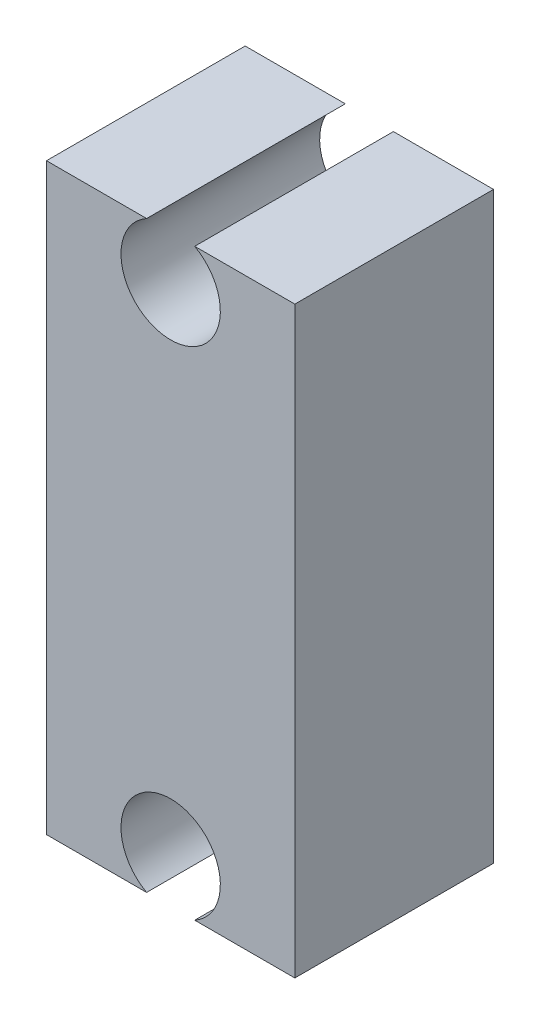
ISO-10303-21;
HEADER;
FILE_DESCRIPTION(('STEP AP214'),'2;1');
FILE_NAME('part.step','',(''),(''),'','','');
FILE_SCHEMA(('AUTOMOTIVE_DESIGN { 1 0 10303 214 1 1 1 1 }'));
ENDSEC;
DATA;
#1=APPLICATION_CONTEXT('core data for automotive mechanical design processes');
#2=APPLICATION_PROTOCOL_DEFINITION('international standard','automotive_design',2000,#1);
#3=PRODUCT_CONTEXT('',#1,'mechanical');
#4=PRODUCT('Part','Part','',(#3));
#5=PRODUCT_RELATED_PRODUCT_CATEGORY('part','',(#4));
#6=PRODUCT_DEFINITION_FORMATION('','',#4);
#7=PRODUCT_DEFINITION_CONTEXT('part definition',#1,'design');
#8=PRODUCT_DEFINITION('design','',#6,#7);
#9=PRODUCT_DEFINITION_SHAPE('','',#8);
#10=(LENGTH_UNIT() NAMED_UNIT(*) SI_UNIT(.MILLI.,.METRE.));
#11=(NAMED_UNIT(*) PLANE_ANGLE_UNIT() SI_UNIT($,.RADIAN.));
#12=(NAMED_UNIT(*) SI_UNIT($,.STERADIAN.) SOLID_ANGLE_UNIT());
#13=UNCERTAINTY_MEASURE_WITH_UNIT(LENGTH_MEASURE(1.E-05),#10,'distance_accuracy_value','');
#14=(GEOMETRIC_REPRESENTATION_CONTEXT(3) GLOBAL_UNCERTAINTY_ASSIGNED_CONTEXT((#13)) GLOBAL_UNIT_ASSIGNED_CONTEXT((#10,
#11,#12)) REPRESENTATION_CONTEXT('',''));
#15=CARTESIAN_POINT('',(0.,0.,0.));
#16=DIRECTION('',(0.,0.,1.));
#17=DIRECTION('',(1.,0.,0.));
#18=AXIS2_PLACEMENT_3D('',#15,#16,#17);
#19=CARTESIAN_POINT('',(-12.7,-15.8514814814815,10.16));
#20=DIRECTION('',(0.,1.,0.));
#21=DIRECTION('',(0.,0.,1.));
#22=AXIS2_PLACEMENT_3D('',#19,#20,#21);
#23=PLANE('',#22);
#24=DIRECTION('',(1.,0.,0.));
#25=VECTOR('',#24,1.);
#26=CARTESIAN_POINT('',(-12.7,-15.8514814814815,0.));
#27=LINE('',#26,#25);
#28=CARTESIAN_POINT('',(-12.7,-15.8514814814815,0.));
#29=VERTEX_POINT('',#28);
#30=CARTESIAN_POINT('',(-7.57967221242086,-15.8514814814815,0.));
#31=VERTEX_POINT('',#30);
#32=EDGE_CURVE('E126',#29,#31,#27,.T.);
#33=ORIENTED_EDGE('',*,*,#32,.T.);
#34=DIRECTION('',(0.,0.,1.));
#35=VECTOR('',#34,1.);
#36=CARTESIAN_POINT('',(-7.57967221242086,-15.8514814814815,0.));
#37=LINE('',#36,#35);
#38=CARTESIAN_POINT('',(-7.57967221242086,-15.8514814814815,10.16));
#39=VERTEX_POINT('',#38);
#40=EDGE_CURVE('E55',#31,#39,#37,.T.);
#41=ORIENTED_EDGE('',*,*,#40,.T.);
#42=DIRECTION('',(1.,0.,0.));
#43=VECTOR('',#42,1.);
#44=CARTESIAN_POINT('',(-12.7,-15.8514814814815,10.16));
#45=LINE('',#44,#43);
#46=CARTESIAN_POINT('',(-12.7,-15.8514814814815,10.16));
#47=VERTEX_POINT('',#46);
#48=EDGE_CURVE('E160',#47,#39,#45,.T.);
#49=ORIENTED_EDGE('',*,*,#48,.F.);
#50=DIRECTION('',(0.,0.,-1.));
#51=VECTOR('',#50,1.);
#52=CARTESIAN_POINT('',(-12.7,-15.8514814814815,10.16));
#53=LINE('',#52,#51);
#54=EDGE_CURVE('E109',#47,#29,#53,.T.);
#55=ORIENTED_EDGE('',*,*,#54,.T.);
#56=EDGE_LOOP('',(#33,#41,#49,#55));
#57=FACE_BOUND('',#56,.T.);
#58=ADVANCED_FACE('F39',(#57),#23,.F.);
#59=CARTESIAN_POINT('',(-12.7,13.9935185185185,10.16));
#60=DIRECTION('',(0.,-1.,0.));
#61=DIRECTION('',(0.,0.,-1.));
#62=AXIS2_PLACEMENT_3D('',#59,#60,#61);
#63=PLANE('',#62);
#64=DIRECTION('',(-1.,0.,0.));
#65=VECTOR('',#64,1.);
#66=CARTESIAN_POINT('',(-12.7,13.9935185185185,0.));
#67=LINE('',#66,#65);
#68=CARTESIAN_POINT('',(0.,13.9935185185185,0.));
#69=VERTEX_POINT('',#68);
#70=CARTESIAN_POINT('',(-5.12032778757915,13.9935185185185,0.));
#71=VERTEX_POINT('',#70);
#72=EDGE_CURVE('E138',#69,#71,#67,.T.);
#73=ORIENTED_EDGE('',*,*,#72,.T.);
#74=DIRECTION('',(0.,0.,1.));
#75=VECTOR('',#74,1.);
#76=CARTESIAN_POINT('',(-5.12032778757915,13.9935185185185,0.));
#77=LINE('',#76,#75);
#78=CARTESIAN_POINT('',(-5.12032778757915,13.9935185185185,10.16));
#79=VERTEX_POINT('',#78);
#80=EDGE_CURVE('E63',#71,#79,#77,.T.);
#81=ORIENTED_EDGE('',*,*,#80,.T.);
#82=DIRECTION('',(-1.,0.,0.));
#83=VECTOR('',#82,1.);
#84=CARTESIAN_POINT('',(-12.7,13.9935185185185,10.16));
#85=LINE('',#84,#83);
#86=CARTESIAN_POINT('',(0.,13.9935185185185,10.16));
#87=VERTEX_POINT('',#86);
#88=EDGE_CURVE('E148',#87,#79,#85,.T.);
#89=ORIENTED_EDGE('',*,*,#88,.F.);
#90=DIRECTION('',(0.,0.,-1.));
#91=VECTOR('',#90,1.);
#92=CARTESIAN_POINT('',(0.,13.9935185185185,10.16));
#93=LINE('',#92,#91);
#94=EDGE_CURVE('E147',#87,#69,#93,.T.);
#95=ORIENTED_EDGE('',*,*,#94,.T.);
#96=EDGE_LOOP('',(#73,#81,#89,#95));
#97=FACE_BOUND('',#96,.T.);
#98=ADVANCED_FACE('F199',(#97),#63,.F.);
#99=CARTESIAN_POINT('',(-12.7,13.9935185185185,10.16));
#100=DIRECTION('',(1.,0.,0.));
#101=DIRECTION('',(0.,1.,0.));
#102=AXIS2_PLACEMENT_3D('',#99,#100,#101);
#103=PLANE('',#102);
#104=DIRECTION('',(0.,-1.,0.));
#105=VECTOR('',#104,1.);
#106=CARTESIAN_POINT('',(-12.7,13.9935185185185,0.));
#107=LINE('',#106,#105);
#108=CARTESIAN_POINT('',(-12.7,13.9935185185185,0.));
#109=VERTEX_POINT('',#108);
#110=EDGE_CURVE('E127',#109,#29,#107,.T.);
#111=ORIENTED_EDGE('',*,*,#110,.T.);
#112=ORIENTED_EDGE('',*,*,#54,.F.);
#113=DIRECTION('',(0.,-1.,0.));
#114=VECTOR('',#113,1.);
#115=CARTESIAN_POINT('',(-12.7,13.9935185185185,10.16));
#116=LINE('',#115,#114);
#117=CARTESIAN_POINT('',(-12.7,13.9935185185185,10.16));
#118=VERTEX_POINT('',#117);
#119=EDGE_CURVE('E142',#118,#47,#116,.T.);
#120=ORIENTED_EDGE('',*,*,#119,.F.);
#121=DIRECTION('',(0.,0.,-1.));
#122=VECTOR('',#121,1.);
#123=CARTESIAN_POINT('',(-12.7,13.9935185185185,10.16));
#124=LINE('',#123,#122);
#125=EDGE_CURVE('E143',#118,#109,#124,.T.);
#126=ORIENTED_EDGE('',*,*,#125,.T.);
#127=EDGE_LOOP('',(#111,#112,#120,#126));
#128=FACE_BOUND('',#127,.T.);
#129=ADVANCED_FACE('F41',(#128),#103,.F.);
#130=CARTESIAN_POINT('',(-5.12032778757914,-15.8514814814815,10.16));
#131=VERTEX_POINT('',#130);
#132=CARTESIAN_POINT('',(0.,-15.8514814814815,10.16));
#133=VERTEX_POINT('',#132);
#134=EDGE_CURVE('E116',#131,#133,#45,.T.);
#135=ORIENTED_EDGE('',*,*,#134,.F.);
#136=DIRECTION('',(0.,0.,1.));
#137=VECTOR('',#136,1.);
#138=CARTESIAN_POINT('',(-5.12032778757914,-15.8514814814815,0.));
#139=LINE('',#138,#137);
#140=CARTESIAN_POINT('',(-5.12032778757914,-15.8514814814815,0.));
#141=VERTEX_POINT('',#140);
#142=EDGE_CURVE('E103',#131,#141,#139,.F.);
#143=ORIENTED_EDGE('',*,*,#142,.T.);
#144=CARTESIAN_POINT('',(0.,-15.8514814814815,0.));
#145=VERTEX_POINT('',#144);
#146=EDGE_CURVE('E114',#141,#145,#27,.T.);
#147=ORIENTED_EDGE('',*,*,#146,.T.);
#148=DIRECTION('',(0.,0.,-1.));
#149=VECTOR('',#148,1.);
#150=CARTESIAN_POINT('',(0.,-15.8514814814815,10.16));
#151=LINE('',#150,#149);
#152=EDGE_CURVE('E152',#133,#145,#151,.T.);
#153=ORIENTED_EDGE('',*,*,#152,.F.);
#154=EDGE_LOOP('',(#135,#143,#147,#153));
#155=FACE_BOUND('',#154,.T.);
#156=ADVANCED_FACE('F112',(#155),#23,.F.);
#157=CARTESIAN_POINT('',(0.,13.9935185185185,10.16));
#158=DIRECTION('',(-1.,0.,0.));
#159=DIRECTION('',(0.,-1.,0.));
#160=AXIS2_PLACEMENT_3D('',#157,#158,#159);
#161=PLANE('',#160);
#162=DIRECTION('',(0.,1.,0.));
#163=VECTOR('',#162,1.);
#164=CARTESIAN_POINT('',(0.,13.9935185185185,0.));
#165=LINE('',#164,#163);
#166=EDGE_CURVE('E124',#145,#69,#165,.T.);
#167=ORIENTED_EDGE('',*,*,#166,.T.);
#168=ORIENTED_EDGE('',*,*,#94,.F.);
#169=DIRECTION('',(0.,1.,0.));
#170=VECTOR('',#169,1.);
#171=CARTESIAN_POINT('',(0.,13.9935185185185,10.16));
#172=LINE('',#171,#170);
#173=EDGE_CURVE('E175',#133,#87,#172,.T.);
#174=ORIENTED_EDGE('',*,*,#173,.F.);
#175=ORIENTED_EDGE('',*,*,#152,.T.);
#176=EDGE_LOOP('',(#167,#168,#174,#175));
#177=FACE_BOUND('',#176,.T.);
#178=ADVANCED_FACE('F203',(#177),#161,.F.);
#179=CARTESIAN_POINT('',(-7.57967221242086,13.9935185185185,10.16));
#180=VERTEX_POINT('',#179);
#181=EDGE_CURVE('E177',#180,#118,#85,.T.);
#182=ORIENTED_EDGE('',*,*,#181,.F.);
#183=DIRECTION('',(0.,0.,1.));
#184=VECTOR('',#183,1.);
#185=CARTESIAN_POINT('',(-7.57967221242086,13.9935185185185,0.));
#186=LINE('',#185,#184);
#187=CARTESIAN_POINT('',(-7.57967221242086,13.9935185185185,0.));
#188=VERTEX_POINT('',#187);
#189=EDGE_CURVE('E187',#180,#188,#186,.F.);
#190=ORIENTED_EDGE('',*,*,#189,.T.);
#191=EDGE_CURVE('E137',#188,#109,#67,.T.);
#192=ORIENTED_EDGE('',*,*,#191,.T.);
#193=ORIENTED_EDGE('',*,*,#125,.F.);
#194=EDGE_LOOP('',(#182,#190,#192,#193));
#195=FACE_BOUND('',#194,.T.);
#196=ADVANCED_FACE('F205',(#195),#63,.F.);
#197=CARTESIAN_POINT('',(0.,0.,10.16));
#198=DIRECTION('',(0.,0.,1.));
#199=DIRECTION('',(1.,0.,0.));
#200=AXIS2_PLACEMENT_3D('',#197,#198,#199);
#201=PLANE('',#200);
#202=CARTESIAN_POINT('',(-6.35,11.7710185185185,10.16));
#203=DIRECTION('',(0.,0.,1.));
#204=DIRECTION('',(1.,0.,0.));
#205=AXIS2_PLACEMENT_3D('',#202,#203,#204);
#206=CIRCLE('',#205,2.54);
#207=EDGE_CURVE('E118',#180,#79,#206,.T.);
#208=ORIENTED_EDGE('',*,*,#207,.F.);
#209=ORIENTED_EDGE('',*,*,#181,.T.);
#210=ORIENTED_EDGE('',*,*,#119,.T.);
#211=ORIENTED_EDGE('',*,*,#48,.T.);
#212=CARTESIAN_POINT('',(-6.35,-13.6289814814815,10.16));
#213=DIRECTION('',(0.,0.,1.));
#214=DIRECTION('',(1.,0.,0.));
#215=AXIS2_PLACEMENT_3D('',#212,#213,#214);
#216=CIRCLE('',#215,2.54);
#217=EDGE_CURVE('E192',#131,#39,#216,.T.);
#218=ORIENTED_EDGE('',*,*,#217,.F.);
#219=ORIENTED_EDGE('',*,*,#134,.T.);
#220=ORIENTED_EDGE('',*,*,#173,.T.);
#221=ORIENTED_EDGE('',*,*,#88,.T.);
#222=EDGE_LOOP('',(#208,#209,#210,#211,#218,#219,#220,#221));
#223=FACE_BOUND('',#222,.T.);
#224=ADVANCED_FACE('F204',(#223),#201,.T.);
#225=CARTESIAN_POINT('',(0.,0.,0.));
#226=DIRECTION('',(0.,0.,1.));
#227=DIRECTION('',(1.,0.,0.));
#228=AXIS2_PLACEMENT_3D('',#225,#226,#227);
#229=PLANE('',#228);
#230=ORIENTED_EDGE('',*,*,#191,.F.);
#231=CARTESIAN_POINT('',(-6.35,11.7710185185185,0.));
#232=DIRECTION('',(0.,0.,1.));
#233=DIRECTION('',(1.,0.,0.));
#234=AXIS2_PLACEMENT_3D('',#231,#232,#233);
#235=CIRCLE('',#234,2.54);
#236=EDGE_CURVE('E11',#188,#71,#235,.T.);
#237=ORIENTED_EDGE('',*,*,#236,.T.);
#238=ORIENTED_EDGE('',*,*,#72,.F.);
#239=ORIENTED_EDGE('',*,*,#166,.F.);
#240=ORIENTED_EDGE('',*,*,#146,.F.);
#241=CARTESIAN_POINT('',(-6.35,-13.6289814814815,0.));
#242=DIRECTION('',(0.,0.,1.));
#243=DIRECTION('',(1.,0.,0.));
#244=AXIS2_PLACEMENT_3D('',#241,#242,#243);
#245=CIRCLE('',#244,2.54);
#246=EDGE_CURVE('E48',#141,#31,#245,.T.);
#247=ORIENTED_EDGE('',*,*,#246,.T.);
#248=ORIENTED_EDGE('',*,*,#32,.F.);
#249=ORIENTED_EDGE('',*,*,#110,.F.);
#250=EDGE_LOOP('',(#230,#237,#238,#239,#240,#247,#248,#249));
#251=FACE_BOUND('',#250,.T.);
#252=ADVANCED_FACE('F122',(#251),#229,.F.);
#253=CARTESIAN_POINT('',(-6.35,-13.6289814814815,0.));
#254=DIRECTION('',(0.,0.,1.));
#255=DIRECTION('',(1.,0.,0.));
#256=AXIS2_PLACEMENT_3D('',#253,#254,#255);
#257=CYLINDRICAL_SURFACE('',#256,2.54);
#258=ORIENTED_EDGE('',*,*,#246,.F.);
#259=ORIENTED_EDGE('',*,*,#142,.F.);
#260=ORIENTED_EDGE('',*,*,#217,.T.);
#261=ORIENTED_EDGE('',*,*,#40,.F.);
#262=EDGE_LOOP('',(#258,#259,#260,#261));
#263=FACE_BOUND('',#262,.T.);
#264=ADVANCED_FACE('F102',(#263),#257,.F.);
#265=CARTESIAN_POINT('',(-6.35,11.7710185185185,0.));
#266=DIRECTION('',(0.,0.,1.));
#267=DIRECTION('',(1.,0.,0.));
#268=AXIS2_PLACEMENT_3D('',#265,#266,#267);
#269=CYLINDRICAL_SURFACE('',#268,2.54);
#270=ORIENTED_EDGE('',*,*,#236,.F.);
#271=ORIENTED_EDGE('',*,*,#189,.F.);
#272=ORIENTED_EDGE('',*,*,#207,.T.);
#273=ORIENTED_EDGE('',*,*,#80,.F.);
#274=EDGE_LOOP('',(#270,#271,#272,#273));
#275=FACE_BOUND('',#274,.T.);
#276=ADVANCED_FACE('F196',(#275),#269,.F.);
#277=CLOSED_SHELL('',(#58,#98,#129,#156,#178,#196,#224,#252,#264,#276));
#278=MANIFOLD_SOLID_BREP('B2',#277);
#279=ADVANCED_BREP_SHAPE_REPRESENTATION('',(#18,#278),#14);
#280=SHAPE_DEFINITION_REPRESENTATION(#9,#279);
ENDSEC;
END-ISO-10303-21;
